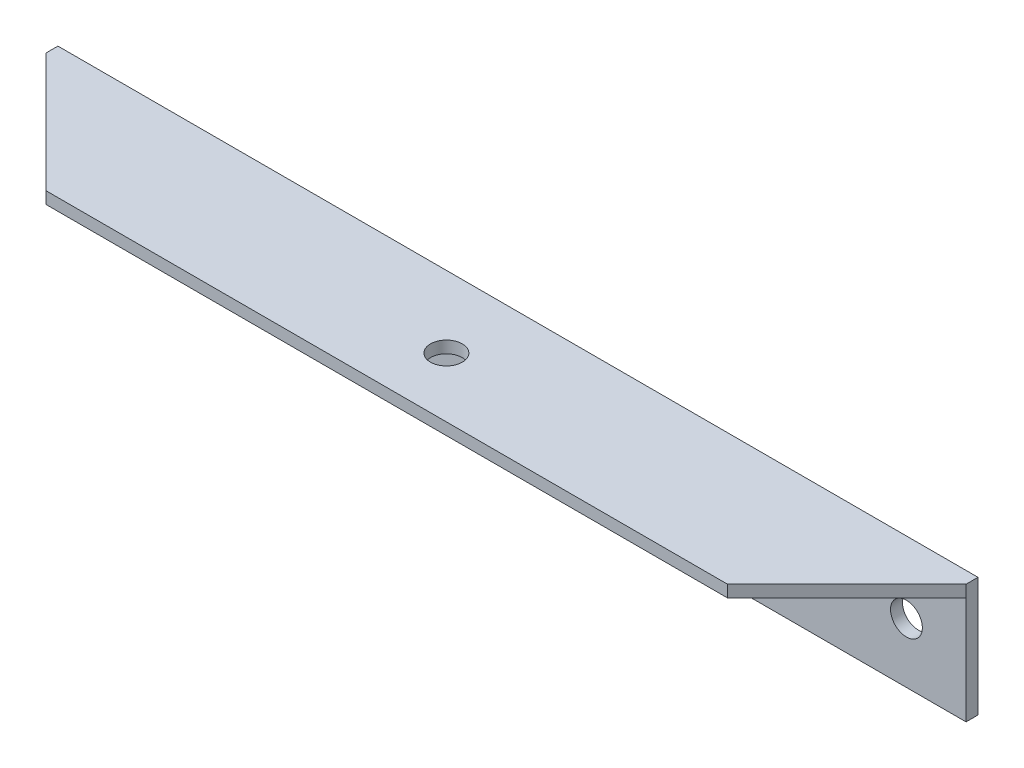
ISO-10303-21;
HEADER;
FILE_DESCRIPTION(('STEP AP214'),'2;1');
FILE_NAME('part.step','',(''),(''),'','','');
FILE_SCHEMA(('AUTOMOTIVE_DESIGN { 1 0 10303 214 1 1 1 1 }'));
ENDSEC;
DATA;
#1=APPLICATION_CONTEXT('core data for automotive mechanical design processes');
#2=APPLICATION_PROTOCOL_DEFINITION('international standard','automotive_design',2000,#1);
#3=PRODUCT_CONTEXT('',#1,'mechanical');
#4=PRODUCT('Part','Part','',(#3));
#5=PRODUCT_RELATED_PRODUCT_CATEGORY('part','',(#4));
#6=PRODUCT_DEFINITION_FORMATION('','',#4);
#7=PRODUCT_DEFINITION_CONTEXT('part definition',#1,'design');
#8=PRODUCT_DEFINITION('design','',#6,#7);
#9=PRODUCT_DEFINITION_SHAPE('','',#8);
#10=(LENGTH_UNIT() NAMED_UNIT(*) SI_UNIT(.MILLI.,.METRE.));
#11=(NAMED_UNIT(*) PLANE_ANGLE_UNIT() SI_UNIT($,.RADIAN.));
#12=(NAMED_UNIT(*) SI_UNIT($,.STERADIAN.) SOLID_ANGLE_UNIT());
#13=UNCERTAINTY_MEASURE_WITH_UNIT(LENGTH_MEASURE(1.E-05),#10,'distance_accuracy_value','');
#14=(GEOMETRIC_REPRESENTATION_CONTEXT(3) GLOBAL_UNCERTAINTY_ASSIGNED_CONTEXT((#13)) GLOBAL_UNIT_ASSIGNED_CONTEXT((#10,
#11,#12)) REPRESENTATION_CONTEXT('',''));
#15=CARTESIAN_POINT('',(0.,0.,0.));
#16=DIRECTION('',(0.,0.,1.));
#17=DIRECTION('',(1.,0.,0.));
#18=AXIS2_PLACEMENT_3D('',#15,#16,#17);
#19=CARTESIAN_POINT('',(-115.7,-30.,3.));
#20=DIRECTION('',(0.,1.,0.));
#21=DIRECTION('',(-1.,0.,0.));
#22=AXIS2_PLACEMENT_3D('',#19,#20,#21);
#23=PLANE('',#22);
#24=DIRECTION('',(1.,0.,0.));
#25=VECTOR('',#24,1.);
#26=CARTESIAN_POINT('',(-115.7,-30.,0.));
#27=LINE('',#26,#25);
#28=CARTESIAN_POINT('',(-115.7,-30.,0.));
#29=VERTEX_POINT('',#28);
#30=CARTESIAN_POINT('',(115.7,-30.,0.));
#31=VERTEX_POINT('',#30);
#32=EDGE_CURVE('E96',#29,#31,#27,.T.);
#33=ORIENTED_EDGE('',*,*,#32,.T.);
#34=DIRECTION('',(0.,0.,-1.));
#35=VECTOR('',#34,1.);
#36=CARTESIAN_POINT('',(115.7,-30.,3.));
#37=LINE('',#36,#35);
#38=CARTESIAN_POINT('',(115.7,-30.,3.));
#39=VERTEX_POINT('',#38);
#40=EDGE_CURVE('E11',#39,#31,#37,.T.);
#41=ORIENTED_EDGE('',*,*,#40,.F.);
#42=DIRECTION('',(1.,0.,0.));
#43=VECTOR('',#42,1.);
#44=CARTESIAN_POINT('',(-115.7,-30.,3.));
#45=LINE('',#44,#43);
#46=CARTESIAN_POINT('',(-115.7,-30.,3.));
#47=VERTEX_POINT('',#46);
#48=EDGE_CURVE('E90',#47,#39,#45,.T.);
#49=ORIENTED_EDGE('',*,*,#48,.F.);
#50=DIRECTION('',(0.,0.,-1.));
#51=VECTOR('',#50,1.);
#52=CARTESIAN_POINT('',(-115.7,-30.,3.));
#53=LINE('',#52,#51);
#54=EDGE_CURVE('E82',#47,#29,#53,.T.);
#55=ORIENTED_EDGE('',*,*,#54,.T.);
#56=EDGE_LOOP('',(#33,#41,#49,#55));
#57=FACE_BOUND('',#56,.T.);
#58=ADVANCED_FACE('F35',(#57),#23,.F.);
#59=CARTESIAN_POINT('',(115.7,0.,3.));
#60=DIRECTION('',(-1.,0.,0.));
#61=DIRECTION('',(0.,0.,1.));
#62=AXIS2_PLACEMENT_3D('',#59,#60,#61);
#63=PLANE('',#62);
#64=DIRECTION('',(0.,1.,0.));
#65=VECTOR('',#64,1.);
#66=CARTESIAN_POINT('',(115.7,0.,0.));
#67=LINE('',#66,#65);
#68=CARTESIAN_POINT('',(115.7,0.,0.));
#69=VERTEX_POINT('',#68);
#70=EDGE_CURVE('E100',#31,#69,#67,.T.);
#71=ORIENTED_EDGE('',*,*,#70,.T.);
#72=DIRECTION('',(0.,0.,-1.));
#73=VECTOR('',#72,1.);
#74=CARTESIAN_POINT('',(115.7,0.,3.));
#75=LINE('',#74,#73);
#76=CARTESIAN_POINT('',(115.7,0.,3.));
#77=VERTEX_POINT('',#76);
#78=EDGE_CURVE('E43',#77,#69,#75,.T.);
#79=ORIENTED_EDGE('',*,*,#78,.F.);
#80=DIRECTION('',(0.,1.,0.));
#81=VECTOR('',#80,1.);
#82=CARTESIAN_POINT('',(115.7,-3.,3.));
#83=LINE('',#82,#81);
#84=CARTESIAN_POINT('',(115.7,-3.,3.));
#85=VERTEX_POINT('',#84);
#86=EDGE_CURVE('E101',#85,#77,#83,.T.);
#87=ORIENTED_EDGE('',*,*,#86,.F.);
#88=DIRECTION('',(0.,1.,0.));
#89=VECTOR('',#88,1.);
#90=CARTESIAN_POINT('',(115.7,0.,3.));
#91=LINE('',#90,#89);
#92=EDGE_CURVE('E171',#39,#85,#91,.T.);
#93=ORIENTED_EDGE('',*,*,#92,.F.);
#94=ORIENTED_EDGE('',*,*,#40,.T.);
#95=EDGE_LOOP('',(#71,#79,#87,#93,#94));
#96=FACE_BOUND('',#95,.T.);
#97=ADVANCED_FACE('F123',(#96),#63,.F.);
#98=CARTESIAN_POINT('',(-115.7,0.,3.));
#99=DIRECTION('',(0.,-1.,0.));
#100=DIRECTION('',(0.,0.,-1.));
#101=AXIS2_PLACEMENT_3D('',#98,#99,#100);
#102=PLANE('',#101);
#103=CARTESIAN_POINT('',(0.,0.,18.));
#104=DIRECTION('',(0.,-1.,0.));
#105=DIRECTION('',(0.,0.,-1.));
#106=AXIS2_PLACEMENT_3D('',#103,#104,#105);
#107=CIRCLE('',#106,4.);
#108=CARTESIAN_POINT('',(0.,0.,14.));
#109=VERTEX_POINT('',#108);
#110=EDGE_CURVE('E202',#109,#109,#107,.T.);
#111=ORIENTED_EDGE('',*,*,#110,.T.);
#112=EDGE_LOOP('',(#111));
#113=FACE_BOUND('',#112,.T.);
#114=DIRECTION('',(-1.,0.,0.));
#115=VECTOR('',#114,1.);
#116=CARTESIAN_POINT('',(-115.7,0.,0.));
#117=LINE('',#116,#115);
#118=CARTESIAN_POINT('',(-115.7,0.,0.));
#119=VERTEX_POINT('',#118);
#120=EDGE_CURVE('E91',#69,#119,#117,.T.);
#121=ORIENTED_EDGE('',*,*,#120,.T.);
#122=DIRECTION('',(0.,0.,-1.));
#123=VECTOR('',#122,1.);
#124=CARTESIAN_POINT('',(-115.7,0.,3.));
#125=LINE('',#124,#123);
#126=CARTESIAN_POINT('',(-115.7,0.,3.));
#127=VERTEX_POINT('',#126);
#128=EDGE_CURVE('E86',#127,#119,#125,.T.);
#129=ORIENTED_EDGE('',*,*,#128,.F.);
#130=DIRECTION('',(0.707106781186546,0.,0.707106781186549));
#131=VECTOR('',#130,1.);
#132=CARTESIAN_POINT('',(-115.7,0.,3.));
#133=LINE('',#132,#131);
#134=CARTESIAN_POINT('',(-85.7000000000001,0.,33.));
#135=VERTEX_POINT('',#134);
#136=EDGE_CURVE('E167',#127,#135,#133,.T.);
#137=ORIENTED_EDGE('',*,*,#136,.T.);
#138=DIRECTION('',(1.,0.,0.));
#139=VECTOR('',#138,1.);
#140=CARTESIAN_POINT('',(-85.7000000000001,0.,33.));
#141=LINE('',#140,#139);
#142=CARTESIAN_POINT('',(85.6999999999997,0.,33.));
#143=VERTEX_POINT('',#142);
#144=EDGE_CURVE('E149',#135,#143,#141,.T.);
#145=ORIENTED_EDGE('',*,*,#144,.T.);
#146=DIRECTION('',(0.707106781186551,0.,-0.707106781186544));
#147=VECTOR('',#146,1.);
#148=CARTESIAN_POINT('',(115.7,0.,3.));
#149=LINE('',#148,#147);
#150=EDGE_CURVE('E120',#143,#77,#149,.T.);
#151=ORIENTED_EDGE('',*,*,#150,.T.);
#152=ORIENTED_EDGE('',*,*,#78,.T.);
#153=EDGE_LOOP('',(#121,#129,#137,#145,#151,#152));
#154=FACE_BOUND('',#153,.T.);
#155=ADVANCED_FACE('F116',(#113,#154),#102,.F.);
#156=CARTESIAN_POINT('',(-115.7,0.,3.));
#157=DIRECTION('',(1.,0.,0.));
#158=DIRECTION('',(0.,0.,-1.));
#159=AXIS2_PLACEMENT_3D('',#156,#157,#158);
#160=PLANE('',#159);
#161=DIRECTION('',(0.,-1.,0.));
#162=VECTOR('',#161,1.);
#163=CARTESIAN_POINT('',(-115.7,0.,0.));
#164=LINE('',#163,#162);
#165=EDGE_CURVE('E79',#119,#29,#164,.T.);
#166=ORIENTED_EDGE('',*,*,#165,.T.);
#167=ORIENTED_EDGE('',*,*,#54,.F.);
#168=DIRECTION('',(0.,-1.,0.));
#169=VECTOR('',#168,1.);
#170=CARTESIAN_POINT('',(-115.7,0.,3.));
#171=LINE('',#170,#169);
#172=CARTESIAN_POINT('',(-115.7,-3.,3.));
#173=VERTEX_POINT('',#172);
#174=EDGE_CURVE('E59',#173,#47,#171,.T.);
#175=ORIENTED_EDGE('',*,*,#174,.F.);
#176=EDGE_CURVE('E97',#127,#173,#171,.T.);
#177=ORIENTED_EDGE('',*,*,#176,.F.);
#178=ORIENTED_EDGE('',*,*,#128,.T.);
#179=EDGE_LOOP('',(#166,#167,#175,#177,#178));
#180=FACE_BOUND('',#179,.T.);
#181=ADVANCED_FACE('F81',(#180),#160,.F.);
#182=CARTESIAN_POINT('',(0.,0.,3.));
#183=DIRECTION('',(0.,0.,-1.));
#184=DIRECTION('',(-1.,0.,0.));
#185=AXIS2_PLACEMENT_3D('',#182,#183,#184);
#186=PLANE('',#185);
#187=CARTESIAN_POINT('',(-100.7,-15.,3.));
#188=DIRECTION('',(0.,0.,-1.));
#189=DIRECTION('',(-1.,0.,0.));
#190=AXIS2_PLACEMENT_3D('',#187,#188,#189);
#191=CIRCLE('',#190,4.);
#192=CARTESIAN_POINT('',(-104.7,-15.,3.));
#193=VERTEX_POINT('',#192);
#194=EDGE_CURVE('E38',#193,#193,#191,.T.);
#195=ORIENTED_EDGE('',*,*,#194,.T.);
#196=EDGE_LOOP('',(#195));
#197=FACE_BOUND('',#196,.T.);
#198=CARTESIAN_POINT('',(100.7,-15.,3.));
#199=DIRECTION('',(0.,0.,-1.));
#200=DIRECTION('',(-1.,0.,0.));
#201=AXIS2_PLACEMENT_3D('',#198,#199,#200);
#202=CIRCLE('',#201,4.);
#203=CARTESIAN_POINT('',(96.7,-15.,3.));
#204=VERTEX_POINT('',#203);
#205=EDGE_CURVE('E162',#204,#204,#202,.T.);
#206=ORIENTED_EDGE('',*,*,#205,.T.);
#207=EDGE_LOOP('',(#206));
#208=FACE_BOUND('',#207,.T.);
#209=ORIENTED_EDGE('',*,*,#92,.T.);
#210=DIRECTION('',(-1.,0.,0.));
#211=VECTOR('',#210,1.);
#212=CARTESIAN_POINT('',(-115.7,-3.,3.));
#213=LINE('',#212,#211);
#214=EDGE_CURVE('E152',#85,#173,#213,.T.);
#215=ORIENTED_EDGE('',*,*,#214,.T.);
#216=ORIENTED_EDGE('',*,*,#174,.T.);
#217=ORIENTED_EDGE('',*,*,#48,.T.);
#218=EDGE_LOOP('',(#209,#215,#216,#217));
#219=FACE_BOUND('',#218,.T.);
#220=ADVANCED_FACE('F172',(#197,#208,#219),#186,.F.);
#221=CARTESIAN_POINT('',(0.,0.,0.));
#222=DIRECTION('',(0.,0.,-1.));
#223=DIRECTION('',(-1.,0.,0.));
#224=AXIS2_PLACEMENT_3D('',#221,#222,#223);
#225=PLANE('',#224);
#226=CARTESIAN_POINT('',(-100.7,-15.,0.));
#227=DIRECTION('',(0.,0.,-1.));
#228=DIRECTION('',(-1.,0.,0.));
#229=AXIS2_PLACEMENT_3D('',#226,#227,#228);
#230=CIRCLE('',#229,4.);
#231=CARTESIAN_POINT('',(-104.7,-15.,0.));
#232=VERTEX_POINT('',#231);
#233=EDGE_CURVE('E204',#232,#232,#230,.T.);
#234=ORIENTED_EDGE('',*,*,#233,.F.);
#235=EDGE_LOOP('',(#234));
#236=FACE_BOUND('',#235,.T.);
#237=CARTESIAN_POINT('',(100.7,-15.,0.));
#238=DIRECTION('',(0.,0.,-1.));
#239=DIRECTION('',(-1.,0.,0.));
#240=AXIS2_PLACEMENT_3D('',#237,#238,#239);
#241=CIRCLE('',#240,4.);
#242=CARTESIAN_POINT('',(96.7,-15.,0.));
#243=VERTEX_POINT('',#242);
#244=EDGE_CURVE('E211',#243,#243,#241,.T.);
#245=ORIENTED_EDGE('',*,*,#244,.F.);
#246=EDGE_LOOP('',(#245));
#247=FACE_BOUND('',#246,.T.);
#248=ORIENTED_EDGE('',*,*,#32,.F.);
#249=ORIENTED_EDGE('',*,*,#165,.F.);
#250=ORIENTED_EDGE('',*,*,#120,.F.);
#251=ORIENTED_EDGE('',*,*,#70,.F.);
#252=EDGE_LOOP('',(#248,#249,#250,#251));
#253=FACE_BOUND('',#252,.T.);
#254=ADVANCED_FACE('F99',(#236,#247,#253),#225,.T.);
#255=CARTESIAN_POINT('',(-115.7,-3.,3.));
#256=DIRECTION('',(-0.707106781186549,0.,0.707106781186546));
#257=DIRECTION('',(0.707106781186546,0.,0.707106781186549));
#258=AXIS2_PLACEMENT_3D('',#255,#256,#257);
#259=PLANE('',#258);
#260=ORIENTED_EDGE('',*,*,#136,.F.);
#261=ORIENTED_EDGE('',*,*,#176,.T.);
#262=DIRECTION('',(0.707106781186546,0.,0.707106781186549));
#263=VECTOR('',#262,1.);
#264=CARTESIAN_POINT('',(-115.7,-3.,3.));
#265=LINE('',#264,#263);
#266=CARTESIAN_POINT('',(-85.7000000000001,-3.,33.));
#267=VERTEX_POINT('',#266);
#268=EDGE_CURVE('E50',#173,#267,#265,.T.);
#269=ORIENTED_EDGE('',*,*,#268,.T.);
#270=DIRECTION('',(0.,1.,0.));
#271=VECTOR('',#270,1.);
#272=CARTESIAN_POINT('',(-85.7000000000001,-3.,33.));
#273=LINE('',#272,#271);
#274=EDGE_CURVE('E146',#267,#135,#273,.T.);
#275=ORIENTED_EDGE('',*,*,#274,.T.);
#276=EDGE_LOOP('',(#260,#261,#269,#275));
#277=FACE_BOUND('',#276,.T.);
#278=ADVANCED_FACE('F158',(#277),#259,.T.);
#279=CARTESIAN_POINT('',(115.7,-3.,3.));
#280=DIRECTION('',(0.707106781186544,0.,0.707106781186551));
#281=DIRECTION('',(0.707106781186551,0.,-0.707106781186544));
#282=AXIS2_PLACEMENT_3D('',#279,#280,#281);
#283=PLANE('',#282);
#284=ORIENTED_EDGE('',*,*,#150,.F.);
#285=DIRECTION('',(0.,1.,0.));
#286=VECTOR('',#285,1.);
#287=CARTESIAN_POINT('',(85.6999999999997,-3.,33.));
#288=LINE('',#287,#286);
#289=CARTESIAN_POINT('',(85.6999999999997,-3.,33.));
#290=VERTEX_POINT('',#289);
#291=EDGE_CURVE('E105',#290,#143,#288,.T.);
#292=ORIENTED_EDGE('',*,*,#291,.F.);
#293=DIRECTION('',(0.707106781186551,0.,-0.707106781186544));
#294=VECTOR('',#293,1.);
#295=CARTESIAN_POINT('',(115.7,-3.,3.));
#296=LINE('',#295,#294);
#297=EDGE_CURVE('E156',#290,#85,#296,.T.);
#298=ORIENTED_EDGE('',*,*,#297,.T.);
#299=ORIENTED_EDGE('',*,*,#86,.T.);
#300=EDGE_LOOP('',(#284,#292,#298,#299));
#301=FACE_BOUND('',#300,.T.);
#302=ADVANCED_FACE('F233',(#301),#283,.T.);
#303=CARTESIAN_POINT('',(-85.7000000000001,-3.,33.));
#304=DIRECTION('',(0.,0.,1.));
#305=DIRECTION('',(1.,0.,0.));
#306=AXIS2_PLACEMENT_3D('',#303,#304,#305);
#307=PLANE('',#306);
#308=ORIENTED_EDGE('',*,*,#144,.F.);
#309=ORIENTED_EDGE('',*,*,#274,.F.);
#310=DIRECTION('',(1.,0.,0.));
#311=VECTOR('',#310,1.);
#312=CARTESIAN_POINT('',(-85.7000000000001,-3.,33.));
#313=LINE('',#312,#311);
#314=EDGE_CURVE('E148',#267,#290,#313,.T.);
#315=ORIENTED_EDGE('',*,*,#314,.T.);
#316=ORIENTED_EDGE('',*,*,#291,.T.);
#317=EDGE_LOOP('',(#308,#309,#315,#316));
#318=FACE_BOUND('',#317,.T.);
#319=ADVANCED_FACE('F147',(#318),#307,.T.);
#320=CARTESIAN_POINT('',(0.,-3.,0.));
#321=DIRECTION('',(0.,-1.,0.));
#322=DIRECTION('',(0.,0.,-1.));
#323=AXIS2_PLACEMENT_3D('',#320,#321,#322);
#324=PLANE('',#323);
#325=CARTESIAN_POINT('',(0.,-3.,18.));
#326=DIRECTION('',(0.,-1.,0.));
#327=DIRECTION('',(0.,0.,-1.));
#328=AXIS2_PLACEMENT_3D('',#325,#326,#327);
#329=CIRCLE('',#328,4.);
#330=CARTESIAN_POINT('',(0.,-3.,14.));
#331=VERTEX_POINT('',#330);
#332=EDGE_CURVE('E205',#331,#331,#329,.T.);
#333=ORIENTED_EDGE('',*,*,#332,.F.);
#334=EDGE_LOOP('',(#333));
#335=FACE_BOUND('',#334,.T.);
#336=ORIENTED_EDGE('',*,*,#268,.F.);
#337=ORIENTED_EDGE('',*,*,#214,.F.);
#338=ORIENTED_EDGE('',*,*,#297,.F.);
#339=ORIENTED_EDGE('',*,*,#314,.F.);
#340=EDGE_LOOP('',(#336,#337,#338,#339));
#341=FACE_BOUND('',#340,.T.);
#342=ADVANCED_FACE('F155',(#335,#341),#324,.T.);
#343=CARTESIAN_POINT('',(100.7,-15.,0.));
#344=DIRECTION('',(0.,0.,-1.));
#345=DIRECTION('',(-1.,0.,0.));
#346=AXIS2_PLACEMENT_3D('',#343,#344,#345);
#347=CYLINDRICAL_SURFACE('',#346,4.);
#348=ORIENTED_EDGE('',*,*,#244,.T.);
#349=EDGE_LOOP('',(#348));
#350=FACE_BOUND('',#349,.T.);
#351=ORIENTED_EDGE('',*,*,#205,.F.);
#352=EDGE_LOOP('',(#351));
#353=FACE_BOUND('',#352,.T.);
#354=ADVANCED_FACE('F221',(#350,#353),#347,.F.);
#355=CARTESIAN_POINT('',(-100.7,-15.,0.));
#356=DIRECTION('',(0.,0.,-1.));
#357=DIRECTION('',(-1.,0.,0.));
#358=AXIS2_PLACEMENT_3D('',#355,#356,#357);
#359=CYLINDRICAL_SURFACE('',#358,4.);
#360=ORIENTED_EDGE('',*,*,#233,.T.);
#361=EDGE_LOOP('',(#360));
#362=FACE_BOUND('',#361,.T.);
#363=ORIENTED_EDGE('',*,*,#194,.F.);
#364=EDGE_LOOP('',(#363));
#365=FACE_BOUND('',#364,.T.);
#366=ADVANCED_FACE('F218',(#362,#365),#359,.F.);
#367=CARTESIAN_POINT('',(0.,-3.,18.));
#368=DIRECTION('',(0.,-1.,0.));
#369=DIRECTION('',(0.,0.,-1.));
#370=AXIS2_PLACEMENT_3D('',#367,#368,#369);
#371=CYLINDRICAL_SURFACE('',#370,4.);
#372=ORIENTED_EDGE('',*,*,#110,.F.);
#373=EDGE_LOOP('',(#372));
#374=FACE_BOUND('',#373,.T.);
#375=ORIENTED_EDGE('',*,*,#332,.T.);
#376=EDGE_LOOP('',(#375));
#377=FACE_BOUND('',#376,.T.);
#378=ADVANCED_FACE('F220',(#374,#377),#371,.F.);
#379=CLOSED_SHELL('',(#58,#97,#155,#181,#220,#254,#278,#302,#319,#342,#354,#366,#378));
#380=MANIFOLD_SOLID_BREP('B2',#379);
#381=ADVANCED_BREP_SHAPE_REPRESENTATION('',(#18,#380),#14);
#382=SHAPE_DEFINITION_REPRESENTATION(#9,#381);
ENDSEC;
END-ISO-10303-21;
